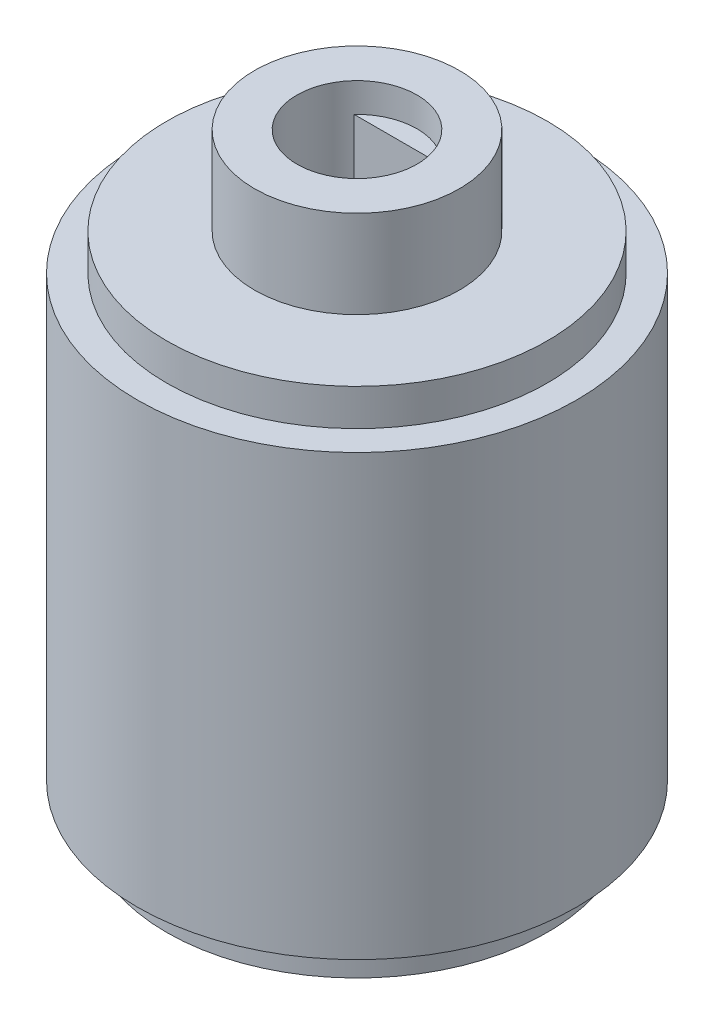
ISO-10303-21;
HEADER;
FILE_DESCRIPTION(('STEP AP214'),'2;1');
FILE_NAME('part.step','',(''),(''),'','','');
FILE_SCHEMA(('AUTOMOTIVE_DESIGN { 1 0 10303 214 1 1 1 1 }'));
ENDSEC;
DATA;
#1=APPLICATION_CONTEXT('core data for automotive mechanical design processes');
#2=APPLICATION_PROTOCOL_DEFINITION('international standard','automotive_design',2000,#1);
#3=PRODUCT_CONTEXT('',#1,'mechanical');
#4=PRODUCT('Part','Part','',(#3));
#5=PRODUCT_RELATED_PRODUCT_CATEGORY('part','',(#4));
#6=PRODUCT_DEFINITION_FORMATION('','',#4);
#7=PRODUCT_DEFINITION_CONTEXT('part definition',#1,'design');
#8=PRODUCT_DEFINITION('design','',#6,#7);
#9=PRODUCT_DEFINITION_SHAPE('','',#8);
#10=(LENGTH_UNIT() NAMED_UNIT(*) SI_UNIT(.MILLI.,.METRE.));
#11=(NAMED_UNIT(*) PLANE_ANGLE_UNIT() SI_UNIT($,.RADIAN.));
#12=(NAMED_UNIT(*) SI_UNIT($,.STERADIAN.) SOLID_ANGLE_UNIT());
#13=UNCERTAINTY_MEASURE_WITH_UNIT(LENGTH_MEASURE(1.E-05),#10,'distance_accuracy_value','');
#14=(GEOMETRIC_REPRESENTATION_CONTEXT(3) GLOBAL_UNCERTAINTY_ASSIGNED_CONTEXT((#13)) GLOBAL_UNIT_ASSIGNED_CONTEXT((#10,
#11,#12)) REPRESENTATION_CONTEXT('',''));
#15=CARTESIAN_POINT('',(0.,0.,0.));
#16=DIRECTION('',(0.,0.,1.));
#17=DIRECTION('',(1.,0.,0.));
#18=AXIS2_PLACEMENT_3D('',#15,#16,#17);
#19=CARTESIAN_POINT('',(0.,25.,-2.8));
#20=DIRECTION('',(0.,0.,1.));
#21=DIRECTION('',(1.,0.,0.));
#22=AXIS2_PLACEMENT_3D('',#19,#20,#21);
#23=PLANE('',#22);
#24=DIRECTION('',(0.,1.,0.));
#25=VECTOR('',#24,1.);
#26=CARTESIAN_POINT('',(2.99499582637439,25.,-2.8));
#27=LINE('',#26,#25);
#28=CARTESIAN_POINT('',(2.99499582637439,25.,-2.8));
#29=VERTEX_POINT('',#28);
#30=CARTESIAN_POINT('',(2.99499582637439,64.,-2.8));
#31=VERTEX_POINT('',#30);
#32=EDGE_CURVE('E53',#29,#31,#27,.T.);
#33=ORIENTED_EDGE('',*,*,#32,.T.);
#34=DIRECTION('',(-1.,0.,0.));
#35=VECTOR('',#34,1.);
#36=CARTESIAN_POINT('',(0.,64.,-2.8));
#37=LINE('',#36,#35);
#38=CARTESIAN_POINT('',(-2.99499582637439,64.,-2.8));
#39=VERTEX_POINT('',#38);
#40=EDGE_CURVE('E67',#31,#39,#37,.T.);
#41=ORIENTED_EDGE('',*,*,#40,.T.);
#42=DIRECTION('',(0.,1.,0.));
#43=VECTOR('',#42,1.);
#44=CARTESIAN_POINT('',(-2.99499582637439,25.,-2.8));
#45=LINE('',#44,#43);
#46=CARTESIAN_POINT('',(-2.99499582637439,25.,-2.8));
#47=VERTEX_POINT('',#46);
#48=EDGE_CURVE('E60',#47,#39,#45,.T.);
#49=ORIENTED_EDGE('',*,*,#48,.F.);
#50=DIRECTION('',(1.,0.,0.));
#51=VECTOR('',#50,1.);
#52=CARTESIAN_POINT('',(0.,25.,-2.8));
#53=LINE('',#52,#51);
#54=EDGE_CURVE('E75',#47,#29,#53,.T.);
#55=ORIENTED_EDGE('',*,*,#54,.T.);
#56=EDGE_LOOP('',(#33,#41,#49,#55));
#57=FACE_BOUND('',#56,.T.);
#58=ADVANCED_FACE('F37',(#57),#23,.T.);
#59=CARTESIAN_POINT('',(0.,25.,0.));
#60=DIRECTION('',(0.,-1.,0.));
#61=DIRECTION('',(0.,0.,-1.));
#62=AXIS2_PLACEMENT_3D('',#59,#60,#61);
#63=PLANE('',#62);
#64=CARTESIAN_POINT('',(0.,25.,0.));
#65=DIRECTION('',(0.,-1.,0.));
#66=DIRECTION('',(0.,0.,-1.));
#67=AXIS2_PLACEMENT_3D('',#64,#65,#66);
#68=CIRCLE('',#67,13.);
#69=CARTESIAN_POINT('',(0.,25.,-13.));
#70=VERTEX_POINT('',#69);
#71=EDGE_CURVE('E77',#70,#70,#68,.T.);
#72=ORIENTED_EDGE('',*,*,#71,.T.);
#73=EDGE_LOOP('',(#72));
#74=FACE_BOUND('',#73,.T.);
#75=CARTESIAN_POINT('',(0.,25.,0.));
#76=DIRECTION('',(0.,1.,0.));
#77=DIRECTION('',(0.,0.,1.));
#78=AXIS2_PLACEMENT_3D('',#75,#76,#77);
#79=CIRCLE('',#78,4.1);
#80=EDGE_CURVE('E82',#47,#29,#79,.T.);
#81=ORIENTED_EDGE('',*,*,#80,.T.);
#82=ORIENTED_EDGE('',*,*,#54,.F.);
#83=EDGE_LOOP('',(#81,#82));
#84=FACE_BOUND('',#83,.T.);
#85=ADVANCED_FACE('F116',(#74,#84),#63,.T.);
#86=CARTESIAN_POINT('',(0.,60.,0.));
#87=DIRECTION('',(0.,-1.,0.));
#88=DIRECTION('',(0.,0.,-1.));
#89=AXIS2_PLACEMENT_3D('',#86,#87,#88);
#90=CYLINDRICAL_SURFACE('',#89,15.);
#91=CARTESIAN_POINT('',(0.,57.5,0.));
#92=DIRECTION('',(0.,1.,0.));
#93=DIRECTION('',(0.,0.,1.));
#94=AXIS2_PLACEMENT_3D('',#91,#92,#93);
#95=CIRCLE('',#94,15.);
#96=CARTESIAN_POINT('',(0.,57.5,15.));
#97=VERTEX_POINT('',#96);
#98=EDGE_CURVE('E41',#97,#97,#95,.T.);
#99=ORIENTED_EDGE('',*,*,#98,.F.);
#100=EDGE_LOOP('',(#99));
#101=FACE_BOUND('',#100,.T.);
#102=CARTESIAN_POINT('',(0.,27.5,0.));
#103=DIRECTION('',(0.,-1.,0.));
#104=DIRECTION('',(0.,0.,-1.));
#105=AXIS2_PLACEMENT_3D('',#102,#103,#104);
#106=CIRCLE('',#105,15.);
#107=CARTESIAN_POINT('',(0.,27.5,-15.));
#108=VERTEX_POINT('',#107);
#109=EDGE_CURVE('E88',#108,#108,#106,.T.);
#110=ORIENTED_EDGE('',*,*,#109,.F.);
#111=EDGE_LOOP('',(#110));
#112=FACE_BOUND('',#111,.T.);
#113=ADVANCED_FACE('F39',(#101,#112),#90,.T.);
#114=CARTESIAN_POINT('',(0.,57.5,0.));
#115=DIRECTION('',(0.,1.,0.));
#116=DIRECTION('',(0.,0.,1.));
#117=AXIS2_PLACEMENT_3D('',#114,#115,#116);
#118=PLANE('',#117);
#119=CARTESIAN_POINT('',(0.,57.5,0.));
#120=DIRECTION('',(0.,1.,0.));
#121=DIRECTION('',(0.,0.,1.));
#122=AXIS2_PLACEMENT_3D('',#119,#120,#121);
#123=CIRCLE('',#122,13.);
#124=CARTESIAN_POINT('',(0.,57.5,13.));
#125=VERTEX_POINT('',#124);
#126=EDGE_CURVE('E93',#125,#125,#123,.T.);
#127=ORIENTED_EDGE('',*,*,#126,.F.);
#128=EDGE_LOOP('',(#127));
#129=FACE_BOUND('',#128,.T.);
#130=ORIENTED_EDGE('',*,*,#98,.T.);
#131=EDGE_LOOP('',(#130));
#132=FACE_BOUND('',#131,.T.);
#133=ADVANCED_FACE('F102',(#129,#132),#118,.T.);
#134=CARTESIAN_POINT('',(0.,57.5,0.));
#135=DIRECTION('',(0.,1.,0.));
#136=DIRECTION('',(0.,0.,1.));
#137=AXIS2_PLACEMENT_3D('',#134,#135,#136);
#138=CYLINDRICAL_SURFACE('',#137,13.);
#139=ORIENTED_EDGE('',*,*,#126,.T.);
#140=EDGE_LOOP('',(#139));
#141=FACE_BOUND('',#140,.T.);
#142=CARTESIAN_POINT('',(0.,60.,0.));
#143=DIRECTION('',(0.,1.,0.));
#144=DIRECTION('',(0.,0.,1.));
#145=AXIS2_PLACEMENT_3D('',#142,#143,#144);
#146=CIRCLE('',#145,13.);
#147=CARTESIAN_POINT('',(0.,60.,13.));
#148=VERTEX_POINT('',#147);
#149=EDGE_CURVE('E92',#148,#148,#146,.T.);
#150=ORIENTED_EDGE('',*,*,#149,.F.);
#151=EDGE_LOOP('',(#150));
#152=FACE_BOUND('',#151,.T.);
#153=ADVANCED_FACE('F100',(#141,#152),#138,.T.);
#154=CARTESIAN_POINT('',(0.,60.,0.));
#155=DIRECTION('',(0.,1.,0.));
#156=DIRECTION('',(0.,0.,1.));
#157=AXIS2_PLACEMENT_3D('',#154,#155,#156);
#158=PLANE('',#157);
#159=CARTESIAN_POINT('',(0.,60.,0.));
#160=DIRECTION('',(0.,1.,0.));
#161=DIRECTION('',(0.,0.,1.));
#162=AXIS2_PLACEMENT_3D('',#159,#160,#161);
#163=CIRCLE('',#162,7.);
#164=CARTESIAN_POINT('',(0.,60.,7.));
#165=VERTEX_POINT('',#164);
#166=EDGE_CURVE('E11',#165,#165,#163,.T.);
#167=ORIENTED_EDGE('',*,*,#166,.F.);
#168=EDGE_LOOP('',(#167));
#169=FACE_BOUND('',#168,.T.);
#170=ORIENTED_EDGE('',*,*,#149,.T.);
#171=EDGE_LOOP('',(#170));
#172=FACE_BOUND('',#171,.T.);
#173=ADVANCED_FACE('F98',(#169,#172),#158,.T.);
#174=CARTESIAN_POINT('',(0.,27.5,0.));
#175=DIRECTION('',(0.,-1.,0.));
#176=DIRECTION('',(0.,0.,-1.));
#177=AXIS2_PLACEMENT_3D('',#174,#175,#176);
#178=PLANE('',#177);
#179=CARTESIAN_POINT('',(0.,27.5,0.));
#180=DIRECTION('',(0.,-1.,0.));
#181=DIRECTION('',(0.,0.,-1.));
#182=AXIS2_PLACEMENT_3D('',#179,#180,#181);
#183=CIRCLE('',#182,13.);
#184=CARTESIAN_POINT('',(0.,27.5,-13.));
#185=VERTEX_POINT('',#184);
#186=EDGE_CURVE('E80',#185,#185,#183,.T.);
#187=ORIENTED_EDGE('',*,*,#186,.F.);
#188=EDGE_LOOP('',(#187));
#189=FACE_BOUND('',#188,.T.);
#190=ORIENTED_EDGE('',*,*,#109,.T.);
#191=EDGE_LOOP('',(#190));
#192=FACE_BOUND('',#191,.T.);
#193=ADVANCED_FACE('F110',(#189,#192),#178,.T.);
#194=CARTESIAN_POINT('',(0.,27.5,0.));
#195=DIRECTION('',(0.,-1.,0.));
#196=DIRECTION('',(0.,0.,-1.));
#197=AXIS2_PLACEMENT_3D('',#194,#195,#196);
#198=CYLINDRICAL_SURFACE('',#197,13.);
#199=ORIENTED_EDGE('',*,*,#186,.T.);
#200=EDGE_LOOP('',(#199));
#201=FACE_BOUND('',#200,.T.);
#202=ORIENTED_EDGE('',*,*,#71,.F.);
#203=EDGE_LOOP('',(#202));
#204=FACE_BOUND('',#203,.T.);
#205=ADVANCED_FACE('F129',(#201,#204),#198,.T.);
#206=CARTESIAN_POINT('',(0.,62.,0.));
#207=DIRECTION('',(0.,-1.,0.));
#208=DIRECTION('',(0.,0.,-1.));
#209=AXIS2_PLACEMENT_3D('',#206,#207,#208);
#210=CYLINDRICAL_SURFACE('',#209,7.);
#211=ORIENTED_EDGE('',*,*,#166,.T.);
#212=EDGE_LOOP('',(#211));
#213=FACE_BOUND('',#212,.T.);
#214=CARTESIAN_POINT('',(0.,66.,0.));
#215=DIRECTION('',(0.,1.,0.));
#216=DIRECTION('',(0.,0.,1.));
#217=AXIS2_PLACEMENT_3D('',#214,#215,#216);
#218=CIRCLE('',#217,7.);
#219=CARTESIAN_POINT('',(0.,66.,7.));
#220=VERTEX_POINT('',#219);
#221=EDGE_CURVE('E276',#220,#220,#218,.T.);
#222=ORIENTED_EDGE('',*,*,#221,.F.);
#223=EDGE_LOOP('',(#222));
#224=FACE_BOUND('',#223,.T.);
#225=ADVANCED_FACE('F126',(#213,#224),#210,.T.);
#226=CARTESIAN_POINT('',(0.,25.,0.));
#227=DIRECTION('',(0.,1.,0.));
#228=DIRECTION('',(0.,0.,1.));
#229=AXIS2_PLACEMENT_3D('',#226,#227,#228);
#230=CYLINDRICAL_SURFACE('',#229,4.1);
#231=CARTESIAN_POINT('',(0.,66.,0.));
#232=DIRECTION('',(0.,-1.,0.));
#233=DIRECTION('',(0.,0.,-1.));
#234=AXIS2_PLACEMENT_3D('',#231,#232,#233);
#235=CIRCLE('',#234,4.1);
#236=CARTESIAN_POINT('',(0.,66.,-4.1));
#237=VERTEX_POINT('',#236);
#238=EDGE_CURVE('E70',#237,#237,#235,.T.);
#239=ORIENTED_EDGE('',*,*,#238,.F.);
#240=EDGE_LOOP('',(#239));
#241=FACE_BOUND('',#240,.T.);
#242=CARTESIAN_POINT('',(0.,64.,0.));
#243=DIRECTION('',(0.,1.,0.));
#244=DIRECTION('',(0.,0.,1.));
#245=AXIS2_PLACEMENT_3D('',#242,#243,#244);
#246=CIRCLE('',#245,4.1);
#247=EDGE_CURVE('E69',#31,#39,#246,.T.);
#248=ORIENTED_EDGE('',*,*,#247,.F.);
#249=ORIENTED_EDGE('',*,*,#32,.F.);
#250=ORIENTED_EDGE('',*,*,#80,.F.);
#251=ORIENTED_EDGE('',*,*,#48,.T.);
#252=EDGE_LOOP('',(#248,#249,#250,#251));
#253=FACE_BOUND('',#252,.T.);
#254=ADVANCED_FACE('F72',(#241,#253),#230,.F.);
#255=CARTESIAN_POINT('',(0.,66.,0.));
#256=DIRECTION('',(0.,1.,0.));
#257=DIRECTION('',(0.,0.,1.));
#258=AXIS2_PLACEMENT_3D('',#255,#256,#257);
#259=PLANE('',#258);
#260=ORIENTED_EDGE('',*,*,#238,.T.);
#261=EDGE_LOOP('',(#260));
#262=FACE_BOUND('',#261,.T.);
#263=ORIENTED_EDGE('',*,*,#221,.T.);
#264=EDGE_LOOP('',(#263));
#265=FACE_BOUND('',#264,.T.);
#266=ADVANCED_FACE('F205',(#262,#265),#259,.T.);
#267=CARTESIAN_POINT('',(0.,64.,0.));
#268=DIRECTION('',(0.,1.,0.));
#269=DIRECTION('',(0.,0.,1.));
#270=AXIS2_PLACEMENT_3D('',#267,#268,#269);
#271=PLANE('',#270);
#272=ORIENTED_EDGE('',*,*,#247,.T.);
#273=ORIENTED_EDGE('',*,*,#40,.F.);
#274=EDGE_LOOP('',(#272,#273));
#275=FACE_BOUND('',#274,.T.);
#276=ADVANCED_FACE('F68',(#275),#271,.T.);
#277=CLOSED_SHELL('',(#58,#85,#113,#133,#153,#173,#193,#205,#225,#254,#266,#276));
#278=MANIFOLD_SOLID_BREP('B2',#277);
#279=ADVANCED_BREP_SHAPE_REPRESENTATION('',(#18,#278),#14);
#280=SHAPE_DEFINITION_REPRESENTATION(#9,#279);
ENDSEC;
END-ISO-10303-21;
